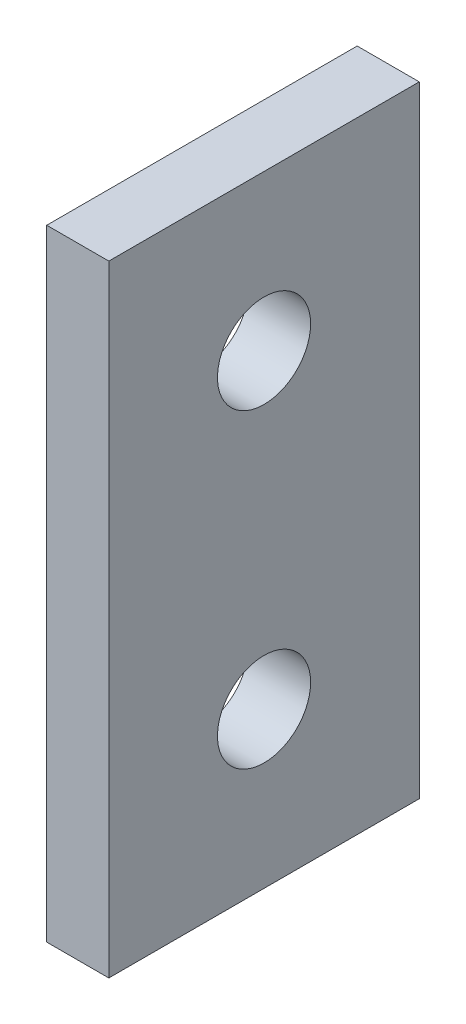
ISO-10303-21;
HEADER;
FILE_DESCRIPTION(('STEP AP214'),'2;1');
FILE_NAME('part.step','',(''),(''),'','','');
FILE_SCHEMA(('AUTOMOTIVE_DESIGN { 1 0 10303 214 1 1 1 1 }'));
ENDSEC;
DATA;
#1=APPLICATION_CONTEXT('core data for automotive mechanical design processes');
#2=APPLICATION_PROTOCOL_DEFINITION('international standard','automotive_design',2000,#1);
#3=PRODUCT_CONTEXT('',#1,'mechanical');
#4=PRODUCT('Part','Part','',(#3));
#5=PRODUCT_RELATED_PRODUCT_CATEGORY('part','',(#4));
#6=PRODUCT_DEFINITION_FORMATION('','',#4);
#7=PRODUCT_DEFINITION_CONTEXT('part definition',#1,'design');
#8=PRODUCT_DEFINITION('design','',#6,#7);
#9=PRODUCT_DEFINITION_SHAPE('','',#8);
#10=(LENGTH_UNIT() NAMED_UNIT(*) SI_UNIT(.MILLI.,.METRE.));
#11=(NAMED_UNIT(*) PLANE_ANGLE_UNIT() SI_UNIT($,.RADIAN.));
#12=(NAMED_UNIT(*) SI_UNIT($,.STERADIAN.) SOLID_ANGLE_UNIT());
#13=UNCERTAINTY_MEASURE_WITH_UNIT(LENGTH_MEASURE(1.E-05),#10,'distance_accuracy_value','');
#14=(GEOMETRIC_REPRESENTATION_CONTEXT(3) GLOBAL_UNCERTAINTY_ASSIGNED_CONTEXT((#13)) GLOBAL_UNIT_ASSIGNED_CONTEXT((#10,
#11,#12)) REPRESENTATION_CONTEXT('',''));
#15=CARTESIAN_POINT('',(0.,0.,0.));
#16=DIRECTION('',(0.,0.,1.));
#17=DIRECTION('',(1.,0.,0.));
#18=AXIS2_PLACEMENT_3D('',#15,#16,#17);
#19=CARTESIAN_POINT('',(2.,0.,0.));
#20=DIRECTION('',(1.,0.,0.));
#21=DIRECTION('',(0.,0.,-1.));
#22=AXIS2_PLACEMENT_3D('',#19,#20,#21);
#23=PLANE('',#22);
#24=CARTESIAN_POINT('',(2.,5.,0.));
#25=DIRECTION('',(1.,0.,0.));
#26=DIRECTION('',(0.,0.,-1.));
#27=AXIS2_PLACEMENT_3D('',#24,#25,#26);
#28=CIRCLE('',#27,1.5);
#29=CARTESIAN_POINT('',(2.,5.,-1.5));
#30=VERTEX_POINT('',#29);
#31=EDGE_CURVE('E100',#30,#30,#28,.T.);
#32=ORIENTED_EDGE('',*,*,#31,.F.);
#33=EDGE_LOOP('',(#32));
#34=FACE_BOUND('',#33,.T.);
#35=DIRECTION('',(0.,1.,0.));
#36=VECTOR('',#35,1.);
#37=CARTESIAN_POINT('',(2.,10.,-5.));
#38=LINE('',#37,#36);
#39=CARTESIAN_POINT('',(2.,-10.,-5.));
#40=VERTEX_POINT('',#39);
#41=CARTESIAN_POINT('',(2.,10.,-5.));
#42=VERTEX_POINT('',#41);
#43=EDGE_CURVE('E85',#40,#42,#38,.T.);
#44=ORIENTED_EDGE('',*,*,#43,.T.);
#45=DIRECTION('',(0.,0.,1.));
#46=VECTOR('',#45,1.);
#47=CARTESIAN_POINT('',(2.,10.,5.));
#48=LINE('',#47,#46);
#49=CARTESIAN_POINT('',(2.,10.,5.));
#50=VERTEX_POINT('',#49);
#51=EDGE_CURVE('E80',#42,#50,#48,.T.);
#52=ORIENTED_EDGE('',*,*,#51,.T.);
#53=DIRECTION('',(0.,-1.,0.));
#54=VECTOR('',#53,1.);
#55=CARTESIAN_POINT('',(2.,10.,5.));
#56=LINE('',#55,#54);
#57=CARTESIAN_POINT('',(2.,-10.,5.));
#58=VERTEX_POINT('',#57);
#59=EDGE_CURVE('E83',#50,#58,#56,.T.);
#60=ORIENTED_EDGE('',*,*,#59,.T.);
#61=DIRECTION('',(0.,0.,-1.));
#62=VECTOR('',#61,1.);
#63=CARTESIAN_POINT('',(2.,-10.,5.));
#64=LINE('',#63,#62);
#65=EDGE_CURVE('E50',#58,#40,#64,.T.);
#66=ORIENTED_EDGE('',*,*,#65,.T.);
#67=EDGE_LOOP('',(#44,#52,#60,#66));
#68=FACE_BOUND('',#67,.T.);
#69=CARTESIAN_POINT('',(2.,-5.,0.));
#70=DIRECTION('',(1.,0.,0.));
#71=DIRECTION('',(0.,0.,-1.));
#72=AXIS2_PLACEMENT_3D('',#69,#70,#71);
#73=CIRCLE('',#72,1.5);
#74=CARTESIAN_POINT('',(2.,-5.,-1.5));
#75=VERTEX_POINT('',#74);
#76=EDGE_CURVE('E115',#75,#75,#73,.T.);
#77=ORIENTED_EDGE('',*,*,#76,.F.);
#78=EDGE_LOOP('',(#77));
#79=FACE_BOUND('',#78,.T.);
#80=ADVANCED_FACE('F33',(#34,#68,#79),#23,.T.);
#81=CARTESIAN_POINT('',(0.,0.,0.));
#82=DIRECTION('',(1.,0.,0.));
#83=DIRECTION('',(0.,0.,-1.));
#84=AXIS2_PLACEMENT_3D('',#81,#82,#83);
#85=PLANE('',#84);
#86=CARTESIAN_POINT('',(0.,5.,0.));
#87=DIRECTION('',(1.,0.,0.));
#88=DIRECTION('',(0.,0.,-1.));
#89=AXIS2_PLACEMENT_3D('',#86,#87,#88);
#90=CIRCLE('',#89,1.5);
#91=CARTESIAN_POINT('',(0.,5.,-1.5));
#92=VERTEX_POINT('',#91);
#93=EDGE_CURVE('E112',#92,#92,#90,.T.);
#94=ORIENTED_EDGE('',*,*,#93,.T.);
#95=EDGE_LOOP('',(#94));
#96=FACE_BOUND('',#95,.T.);
#97=DIRECTION('',(0.,1.,0.));
#98=VECTOR('',#97,1.);
#99=CARTESIAN_POINT('',(0.,10.,-5.));
#100=LINE('',#99,#98);
#101=CARTESIAN_POINT('',(0.,-10.,-5.));
#102=VERTEX_POINT('',#101);
#103=CARTESIAN_POINT('',(0.,10.,-5.));
#104=VERTEX_POINT('',#103);
#105=EDGE_CURVE('E97',#102,#104,#100,.T.);
#106=ORIENTED_EDGE('',*,*,#105,.F.);
#107=DIRECTION('',(0.,0.,-1.));
#108=VECTOR('',#107,1.);
#109=CARTESIAN_POINT('',(0.,-10.,5.));
#110=LINE('',#109,#108);
#111=CARTESIAN_POINT('',(0.,-10.,5.));
#112=VERTEX_POINT('',#111);
#113=EDGE_CURVE('E73',#112,#102,#110,.T.);
#114=ORIENTED_EDGE('',*,*,#113,.F.);
#115=DIRECTION('',(0.,-1.,0.));
#116=VECTOR('',#115,1.);
#117=CARTESIAN_POINT('',(0.,10.,5.));
#118=LINE('',#117,#116);
#119=CARTESIAN_POINT('',(0.,10.,5.));
#120=VERTEX_POINT('',#119);
#121=EDGE_CURVE('E67',#120,#112,#118,.T.);
#122=ORIENTED_EDGE('',*,*,#121,.F.);
#123=DIRECTION('',(0.,0.,1.));
#124=VECTOR('',#123,1.);
#125=CARTESIAN_POINT('',(0.,10.,5.));
#126=LINE('',#125,#124);
#127=EDGE_CURVE('E89',#104,#120,#126,.T.);
#128=ORIENTED_EDGE('',*,*,#127,.F.);
#129=EDGE_LOOP('',(#106,#114,#122,#128));
#130=FACE_BOUND('',#129,.T.);
#131=CARTESIAN_POINT('',(0.,-5.,0.));
#132=DIRECTION('',(1.,0.,0.));
#133=DIRECTION('',(0.,0.,-1.));
#134=AXIS2_PLACEMENT_3D('',#131,#132,#133);
#135=CIRCLE('',#134,1.5);
#136=CARTESIAN_POINT('',(0.,-5.,-1.5));
#137=VERTEX_POINT('',#136);
#138=EDGE_CURVE('E118',#137,#137,#135,.T.);
#139=ORIENTED_EDGE('',*,*,#138,.T.);
#140=EDGE_LOOP('',(#139));
#141=FACE_BOUND('',#140,.T.);
#142=ADVANCED_FACE('F108',(#96,#130,#141),#85,.F.);
#143=CARTESIAN_POINT('',(2.,10.,-5.));
#144=DIRECTION('',(0.,0.,1.));
#145=DIRECTION('',(0.,-1.,0.));
#146=AXIS2_PLACEMENT_3D('',#143,#144,#145);
#147=PLANE('',#146);
#148=ORIENTED_EDGE('',*,*,#105,.T.);
#149=DIRECTION('',(-1.,0.,0.));
#150=VECTOR('',#149,1.);
#151=CARTESIAN_POINT('',(2.,10.,-5.));
#152=LINE('',#151,#150);
#153=EDGE_CURVE('E11',#42,#104,#152,.T.);
#154=ORIENTED_EDGE('',*,*,#153,.F.);
#155=ORIENTED_EDGE('',*,*,#43,.F.);
#156=DIRECTION('',(-1.,0.,0.));
#157=VECTOR('',#156,1.);
#158=CARTESIAN_POINT('',(2.,-10.,-5.));
#159=LINE('',#158,#157);
#160=EDGE_CURVE('E93',#40,#102,#159,.T.);
#161=ORIENTED_EDGE('',*,*,#160,.T.);
#162=EDGE_LOOP('',(#148,#154,#155,#161));
#163=FACE_BOUND('',#162,.T.);
#164=ADVANCED_FACE('F35',(#163),#147,.F.);
#165=CARTESIAN_POINT('',(2.,10.,5.));
#166=DIRECTION('',(0.,-1.,0.));
#167=DIRECTION('',(0.,0.,-1.));
#168=AXIS2_PLACEMENT_3D('',#165,#166,#167);
#169=PLANE('',#168);
#170=ORIENTED_EDGE('',*,*,#127,.T.);
#171=DIRECTION('',(-1.,0.,0.));
#172=VECTOR('',#171,1.);
#173=CARTESIAN_POINT('',(2.,10.,5.));
#174=LINE('',#173,#172);
#175=EDGE_CURVE('E42',#50,#120,#174,.T.);
#176=ORIENTED_EDGE('',*,*,#175,.F.);
#177=ORIENTED_EDGE('',*,*,#51,.F.);
#178=ORIENTED_EDGE('',*,*,#153,.T.);
#179=EDGE_LOOP('',(#170,#176,#177,#178));
#180=FACE_BOUND('',#179,.T.);
#181=ADVANCED_FACE('F88',(#180),#169,.F.);
#182=CARTESIAN_POINT('',(2.,10.,5.));
#183=DIRECTION('',(0.,0.,-1.));
#184=DIRECTION('',(0.,1.,0.));
#185=AXIS2_PLACEMENT_3D('',#182,#183,#184);
#186=PLANE('',#185);
#187=ORIENTED_EDGE('',*,*,#121,.T.);
#188=DIRECTION('',(-1.,0.,0.));
#189=VECTOR('',#188,1.);
#190=CARTESIAN_POINT('',(2.,-10.,5.));
#191=LINE('',#190,#189);
#192=EDGE_CURVE('E90',#58,#112,#191,.T.);
#193=ORIENTED_EDGE('',*,*,#192,.F.);
#194=ORIENTED_EDGE('',*,*,#59,.F.);
#195=ORIENTED_EDGE('',*,*,#175,.T.);
#196=EDGE_LOOP('',(#187,#193,#194,#195));
#197=FACE_BOUND('',#196,.T.);
#198=ADVANCED_FACE('F91',(#197),#186,.F.);
#199=CARTESIAN_POINT('',(2.,-10.,5.));
#200=DIRECTION('',(0.,1.,0.));
#201=DIRECTION('',(0.,0.,1.));
#202=AXIS2_PLACEMENT_3D('',#199,#200,#201);
#203=PLANE('',#202);
#204=ORIENTED_EDGE('',*,*,#113,.T.);
#205=ORIENTED_EDGE('',*,*,#160,.F.);
#206=ORIENTED_EDGE('',*,*,#65,.F.);
#207=ORIENTED_EDGE('',*,*,#192,.T.);
#208=EDGE_LOOP('',(#204,#205,#206,#207));
#209=FACE_BOUND('',#208,.T.);
#210=ADVANCED_FACE('F105',(#209),#203,.F.);
#211=CARTESIAN_POINT('',(2.,5.,0.));
#212=DIRECTION('',(-1.,0.,0.));
#213=DIRECTION('',(0.,0.,1.));
#214=AXIS2_PLACEMENT_3D('',#211,#212,#213);
#215=CYLINDRICAL_SURFACE('',#214,1.5);
#216=ORIENTED_EDGE('',*,*,#31,.T.);
#217=EDGE_LOOP('',(#216));
#218=FACE_BOUND('',#217,.T.);
#219=ORIENTED_EDGE('',*,*,#93,.F.);
#220=EDGE_LOOP('',(#219));
#221=FACE_BOUND('',#220,.T.);
#222=ADVANCED_FACE('F136',(#218,#221),#215,.F.);
#223=CARTESIAN_POINT('',(2.,-5.,0.));
#224=DIRECTION('',(-1.,0.,0.));
#225=DIRECTION('',(0.,0.,1.));
#226=AXIS2_PLACEMENT_3D('',#223,#224,#225);
#227=CYLINDRICAL_SURFACE('',#226,1.5);
#228=ORIENTED_EDGE('',*,*,#76,.T.);
#229=EDGE_LOOP('',(#228));
#230=FACE_BOUND('',#229,.T.);
#231=ORIENTED_EDGE('',*,*,#138,.F.);
#232=EDGE_LOOP('',(#231));
#233=FACE_BOUND('',#232,.T.);
#234=ADVANCED_FACE('F124',(#230,#233),#227,.F.);
#235=CLOSED_SHELL('',(#80,#142,#164,#181,#198,#210,#222,#234));
#236=MANIFOLD_SOLID_BREP('B2',#235);
#237=ADVANCED_BREP_SHAPE_REPRESENTATION('',(#18,#236),#14);
#238=SHAPE_DEFINITION_REPRESENTATION(#9,#237);
ENDSEC;
END-ISO-10303-21;
